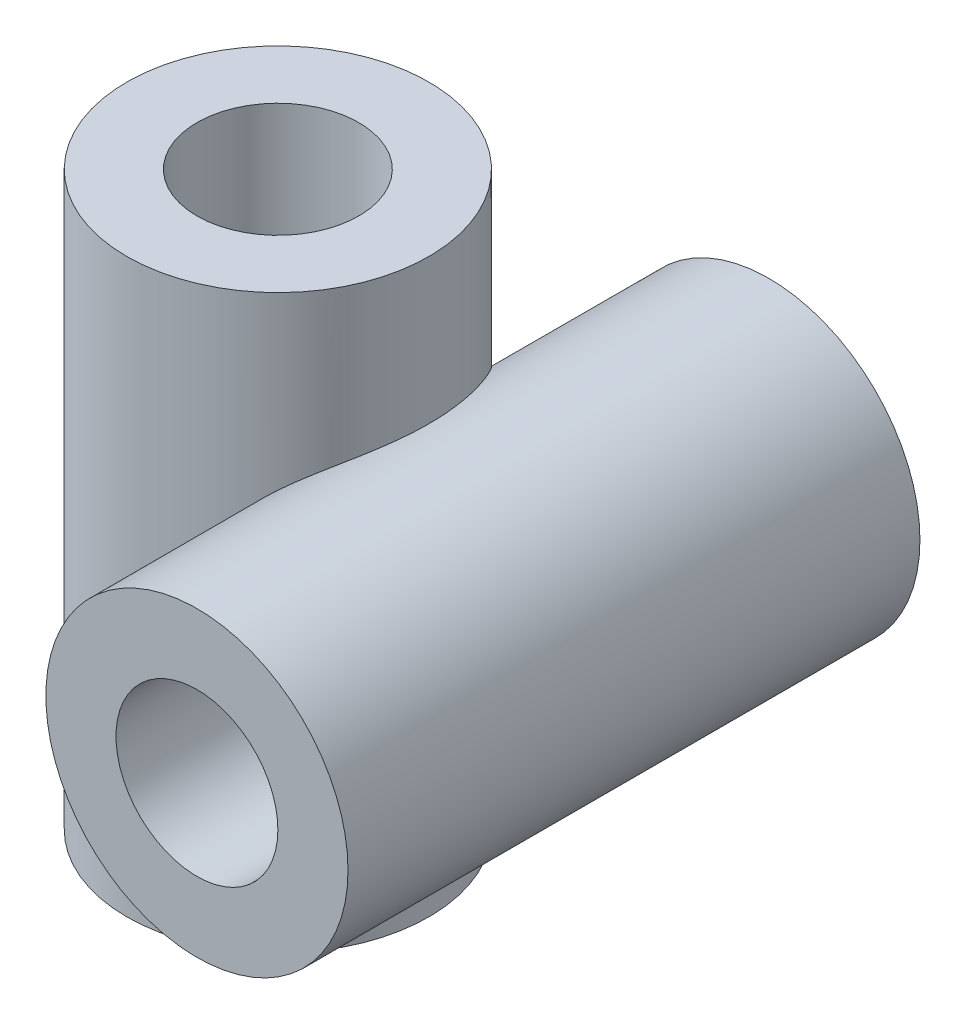
ISO-10303-21;
HEADER;
FILE_DESCRIPTION(('STEP AP214'),'2;1');
FILE_NAME('part.step','',(''),(''),'','','');
FILE_SCHEMA(('AUTOMOTIVE_DESIGN { 1 0 10303 214 1 1 1 1 }'));
ENDSEC;
DATA;
#1=APPLICATION_CONTEXT('core data for automotive mechanical design processes');
#2=APPLICATION_PROTOCOL_DEFINITION('international standard','automotive_design',2000,#1);
#3=PRODUCT_CONTEXT('',#1,'mechanical');
#4=PRODUCT('Part','Part','',(#3));
#5=PRODUCT_RELATED_PRODUCT_CATEGORY('part','',(#4));
#6=PRODUCT_DEFINITION_FORMATION('','',#4);
#7=PRODUCT_DEFINITION_CONTEXT('part definition',#1,'design');
#8=PRODUCT_DEFINITION('design','',#6,#7);
#9=PRODUCT_DEFINITION_SHAPE('','',#8);
#10=(LENGTH_UNIT() NAMED_UNIT(*) SI_UNIT(.MILLI.,.METRE.));
#11=(NAMED_UNIT(*) PLANE_ANGLE_UNIT() SI_UNIT($,.RADIAN.));
#12=(NAMED_UNIT(*) SI_UNIT($,.STERADIAN.) SOLID_ANGLE_UNIT());
#13=UNCERTAINTY_MEASURE_WITH_UNIT(LENGTH_MEASURE(1.E-05),#10,'distance_accuracy_value','');
#14=(GEOMETRIC_REPRESENTATION_CONTEXT(3) GLOBAL_UNCERTAINTY_ASSIGNED_CONTEXT((#13)) GLOBAL_UNIT_ASSIGNED_CONTEXT((#10,
#11,#12)) REPRESENTATION_CONTEXT('',''));
#15=CARTESIAN_POINT('',(0.,0.,0.));
#16=DIRECTION('',(0.,0.,1.));
#17=DIRECTION('',(1.,0.,0.));
#18=AXIS2_PLACEMENT_3D('',#15,#16,#17);
#19=CARTESIAN_POINT('',(-13.280466349688,1.62107894057616E-05,15.8999834577754));
#20=DIRECTION('',(0.,0.,-1.));
#21=DIRECTION('',(-1.,0.,0.));
#22=AXIS2_PLACEMENT_3D('',#19,#20,#21);
#23=CYLINDRICAL_SURFACE('',#22,8.4);
#24=CARTESIAN_POINT('',(-13.280466349688,1.62107894057616E-05,-15.9000165422246));
#25=DIRECTION('',(0.,0.,1.));
#26=DIRECTION('',(1.,0.,0.));
#27=AXIS2_PLACEMENT_3D('',#24,#25,#26);
#28=CIRCLE('',#27,8.4);
#29=CARTESIAN_POINT('',(-4.88046634968801,1.62107894057616E-05,-15.9000165422246));
#30=VERTEX_POINT('',#29);
#31=EDGE_CURVE('E53',#30,#30,#28,.T.);
#32=ORIENTED_EDGE('',*,*,#31,.T.);
#33=EDGE_LOOP('',(#32));
#34=FACE_BOUND('',#33,.T.);
#35=CARTESIAN_POINT('',(-13.280466349688,1.62107894057616E-05,15.8999834577754));
#36=DIRECTION('',(0.,0.,1.));
#37=DIRECTION('',(1.,0.,0.));
#38=AXIS2_PLACEMENT_3D('',#35,#36,#37);
#39=CIRCLE('',#38,8.4);
#40=CARTESIAN_POINT('',(-4.88046634968801,1.62107894057616E-05,15.8999834577754));
#41=VERTEX_POINT('',#40);
#42=EDGE_CURVE('E48',#41,#41,#39,.T.);
#43=ORIENTED_EDGE('',*,*,#42,.F.);
#44=EDGE_LOOP('',(#43));
#45=FACE_BOUND('',#44,.T.);
#46=CARTESIAN_POINT('',(-21.680466349688,1.62107894057616E-05,7.84600155614857));
#47=CARTESIAN_POINT('',(-21.6804658811288,0.213009276547163,7.84600200474655));
#48=CARTESIAN_POINT('',(-21.6723586139103,0.426010761498044,7.8429160419419));
#49=CARTESIAN_POINT('',(-21.6400016775848,0.850608369427983,7.8304286788699));
#50=CARTESIAN_POINT('',(-21.615751037933,1.06220440713855,7.82102689889317));
#51=CARTESIAN_POINT('',(-21.5513254211283,1.48262455674438,7.7954743598727));
#52=CARTESIAN_POINT('',(-21.5111450942864,1.69144771304542,7.77932133344951));
#53=CARTESIAN_POINT('',(-21.4152662078327,2.10478150312994,7.73956739994953));
#54=CARTESIAN_POINT('',(-21.3595679020481,2.30929220739319,7.71596661469466));
#55=CARTESIAN_POINT('',(-21.2330897505828,2.71306988763356,7.66029546315367));
#56=CARTESIAN_POINT('',(-21.1622677386617,2.91232041561602,7.62820135560316));
#57=CARTESIAN_POINT('',(-21.0065177559235,3.30341237864942,7.55442074887091));
#58=CARTESIAN_POINT('',(-20.9215896212678,3.49525372761293,7.51273413827277));
#59=CARTESIAN_POINT('',(-20.7388878993599,3.86981407832613,7.4185083440585));
#60=CARTESIAN_POINT('',(-20.6411219702732,4.05253842968806,7.3659756198958));
#61=CARTESIAN_POINT('',(-20.434295627754,4.40738336048205,7.24871809829957));
#62=CARTESIAN_POINT('',(-20.3252360763075,4.5795047475885,7.18399423104681));
#63=CARTESIAN_POINT('',(-20.1035692897998,4.9032598619759,7.04471641581932));
#64=CARTESIAN_POINT('',(-19.9914175371204,5.05548887589871,6.9708219196799));
#65=CARTESIAN_POINT('',(-19.7608337516443,5.34786579745063,6.81004632912228));
#66=CARTESIAN_POINT('',(-19.642401957473,5.48801416358277,6.72316572791486));
#67=CARTESIAN_POINT('',(-19.4017332416054,5.75522311061452,6.53589954917975));
#68=CARTESIAN_POINT('',(-19.2794989202121,5.88229238994342,6.43552305109479));
#69=CARTESIAN_POINT('',(-19.0337577905012,6.12285895398462,6.2210174632914));
#70=CARTESIAN_POINT('',(-18.9102510805979,6.2363572799215,6.1068894300033));
#71=CARTESIAN_POINT('',(-18.6764902309169,6.43931264907535,5.8767618642815));
#72=CARTESIAN_POINT('',(-18.566106347819,6.53003254911706,5.76200347071762));
#73=CARTESIAN_POINT('',(-18.3484040632656,6.70039777160637,5.52187111119714));
#74=CARTESIAN_POINT('',(-18.2410854445957,6.78004388033276,5.39649789994864));
#75=CARTESIAN_POINT('',(-18.0312667018319,6.92868404185236,5.13575552477083));
#76=CARTESIAN_POINT('',(-17.9287677100455,6.99767560011086,5.00038403089165));
#77=CARTESIAN_POINT('',(-17.7301941806824,7.12559528994008,4.72048798445765));
#78=CARTESIAN_POINT('',(-17.6341198921103,7.18452303160093,4.57596307756264));
#79=CARTESIAN_POINT('',(-17.4489287920682,7.29354586437919,4.27736650582661));
#80=CARTESIAN_POINT('',(-17.3598818934166,7.34355724271624,4.12322101633881));
#81=CARTESIAN_POINT('',(-17.1908584481251,7.43493835480905,3.80758458903021));
#82=CARTESIAN_POINT('',(-17.1108818662976,7.47630812208966,3.64609367970867));
#83=CARTESIAN_POINT('',(-16.9608962728592,7.55127236235985,3.31675718123482));
#84=CARTESIAN_POINT('',(-16.8908898755916,7.58486479744662,3.14890993990163));
#85=CARTESIAN_POINT('',(-16.761581014839,7.64507524335166,2.80792088194501));
#86=CARTESIAN_POINT('',(-16.7022794041219,7.67169269860314,2.63477864479365));
#87=CARTESIAN_POINT('',(-16.5896205953797,7.72100402839462,2.26687323104411));
#88=CARTESIAN_POINT('',(-16.5374307484802,7.74304981807142,2.07166486076563));
#89=CARTESIAN_POINT('',(-16.447164512859,7.78040230699529,1.67737822319741));
#90=CARTESIAN_POINT('',(-16.4090889148248,7.79570862870289,1.47829973975921));
#91=CARTESIAN_POINT('',(-16.3473908591984,7.8201874085224,1.07747293084606));
#92=CARTESIAN_POINT('',(-16.3237734700496,7.82935771570883,0.875723694408277));
#93=CARTESIAN_POINT('',(-16.2912161987666,7.84193484060936,0.470865669173007));
#94=CARTESIAN_POINT('',(-16.2822767398473,7.84534149213758,0.267756841343378));
#95=CARTESIAN_POINT('',(-16.2790401513572,7.84658026044155,-0.153238881806774));
#96=CARTESIAN_POINT('',(-16.2858441151253,7.84399315894045,-0.371136424302473));
#97=CARTESIAN_POINT('',(-16.3163469017055,7.83223771576085,-0.805577253220209));
#98=CARTESIAN_POINT('',(-16.3400466382347,7.82306901815192,-1.02212046576166));
#99=CARTESIAN_POINT('',(-16.4041175229143,7.79770758192926,-1.45238293552532));
#100=CARTESIAN_POINT('',(-16.4444936958347,7.78151272619256,-1.66610132155314));
#101=CARTESIAN_POINT('',(-16.5414928501224,7.74136360585683,-2.08908002532037));
#102=CARTESIAN_POINT('',(-16.5981155837189,7.71740945959128,-2.29834041099489));
#103=CARTESIAN_POINT('',(-16.7271901860286,7.66063509017973,-2.71154991180001));
#104=CARTESIAN_POINT('',(-16.7996989476755,7.62778289773995,-2.91547691015667));
#105=CARTESIAN_POINT('',(-16.9594800219258,7.55201403565815,-3.31554971909115));
#106=CARTESIAN_POINT('',(-17.046752585411,7.50909719498236,-3.51169539737076));
#107=CARTESIAN_POINT('',(-17.2346902986837,7.41185083199071,-3.89434787762617));
#108=CARTESIAN_POINT('',(-17.3353457352935,7.357529570506,-4.08086153540262));
#109=CARTESIAN_POINT('',(-17.5483714648909,7.23603765825386,-4.44268205784288));
#110=CARTESIAN_POINT('',(-17.6607405202395,7.16886836436063,-4.61799010331966));
#111=CARTESIAN_POINT('',(-17.8864689182116,7.0257733826181,-4.94349012069916));
#112=CARTESIAN_POINT('',(-17.9991611318218,6.95084061052164,-5.09458144984642));
#113=CARTESIAN_POINT('',(-18.2306176051984,6.78794780669525,-5.38461169723582));
#114=CARTESIAN_POINT('',(-18.3493815311485,6.69998849064748,-5.52355128243177));
#115=CARTESIAN_POINT('',(-18.5904880290716,6.51055753421973,-5.78829821225019));
#116=CARTESIAN_POINT('',(-18.7128280795194,6.409095243614,-5.91411453715581));
#117=CARTESIAN_POINT('',(-18.958552281378,6.19244315040437,-6.15216759716389));
#118=CARTESIAN_POINT('',(-19.081936357577,6.07725432896993,-6.26440530170885));
#119=CARTESIAN_POINT('',(-19.315208549744,5.84520898971708,-6.46494818442229));
#120=CARTESIAN_POINT('',(-19.4252472321542,5.72959256915708,-6.55451827406206));
#121=CARTESIAN_POINT('',(-19.6420965178034,5.48782290888116,-6.72263899231858));
#122=CARTESIAN_POINT('',(-19.748907354578,5.36167043394978,-6.80119041964397));
#123=CARTESIAN_POINT('',(-19.9575721441289,5.09946132513378,-6.94771656055683));
#124=CARTESIAN_POINT('',(-20.0594248641124,4.96340224883451,-7.01568865282239));
#125=CARTESIAN_POINT('',(-20.2565918767709,4.68223347224901,-7.14165686399585));
#126=CARTESIAN_POINT('',(-20.3519059042504,4.53712340532895,-7.19965257842666));
#127=CARTESIAN_POINT('',(-20.5357483504839,4.23702172465365,-7.30705325010011));
#128=CARTESIAN_POINT('',(-20.6241828399398,4.0819332947463,-7.35634811357319));
#129=CARTESIAN_POINT('',(-20.7918608473444,3.76447902694676,-7.44634481926657));
#130=CARTESIAN_POINT('',(-20.8711043846535,3.60211320438521,-7.48704667958798));
#131=CARTESIAN_POINT('',(-21.0195179215719,3.27110018097634,-7.56072585742027));
#132=CARTESIAN_POINT('',(-21.0886852842948,3.10245135034392,-7.59370115429545));
#133=CARTESIAN_POINT('',(-21.2162237969277,2.75993620284218,-7.6527259531708));
#134=CARTESIAN_POINT('',(-21.2745940927853,2.58606947449821,-7.67877490736569));
#135=CARTESIAN_POINT('',(-21.385244244621,2.21662572786487,-7.72695091429779));
#136=CARTESIAN_POINT('',(-21.4363412621762,2.02060910255775,-7.7484303819763));
#137=CARTESIAN_POINT('',(-21.5243236084844,1.62480186056447,-7.78468261990341));
#138=CARTESIAN_POINT('',(-21.5612081330455,1.4250110309916,-7.79945501065088));
#139=CARTESIAN_POINT('',(-21.6204370648025,1.0228604479532,-7.82288283297935));
#140=CARTESIAN_POINT('',(-21.642776348007,0.820499814764619,-7.83153610901352));
#141=CARTESIAN_POINT('',(-21.67270167597,0.414526925090436,-7.84307760037111));
#142=CARTESIAN_POINT('',(-21.6802873074174,0.210914633700977,-7.84596565418679));
#143=CARTESIAN_POINT('',(-21.6806515172329,-0.21071724464427,-7.84610600634365));
#144=CARTESIAN_POINT('',(-21.6723466031367,-0.428738834127586,-7.84294590915954));
#145=CARTESIAN_POINT('',(-21.6388271544614,-0.863290852639576,-7.8300070291739));
#146=CARTESIAN_POINT('',(-21.6136117142002,-1.07982120117388,-7.82022789187419));
#147=CARTESIAN_POINT('',(-21.5465110044715,-1.50991291209532,-7.7935797388926));
#148=CARTESIAN_POINT('',(-21.504620858981,-1.72347338710931,-7.77670864929869));
#149=CARTESIAN_POINT('',(-21.404615665438,-2.14598537805281,-7.73511403101576));
#150=CARTESIAN_POINT('',(-21.3465008869123,-2.35493697048375,-7.71039063276986));
#151=CARTESIAN_POINT('',(-21.2145883595033,-2.76704101819318,-7.65200324118369));
#152=CARTESIAN_POINT('',(-21.1407586432293,-2.97018068060209,-7.61832098830957));
#153=CARTESIAN_POINT('',(-20.978459321052,-3.36853753305498,-7.54078751968403));
#154=CARTESIAN_POINT('',(-20.8899894857544,-3.56375459890103,-7.49693614458951));
#155=CARTESIAN_POINT('',(-20.6998164794154,-3.94440639699779,-7.39771305770136));
#156=CARTESIAN_POINT('',(-20.5981232696165,-4.12984834658754,-7.34234999910404));
#157=CARTESIAN_POINT('',(-20.3832147622355,-4.48939472637393,-7.21867183007028));
#158=CARTESIAN_POINT('',(-20.2700007046758,-4.66350037342903,-7.15035811286952));
#159=CARTESIAN_POINT('',(-20.0430612528003,-4.98629473551474,-7.00510308967555));
#160=CARTESIAN_POINT('',(-19.9300011154162,-5.13591071764887,-6.92918239422623));
#161=CARTESIAN_POINT('',(-19.6980496712673,-5.42295949758989,-6.76431663865606));
#162=CARTESIAN_POINT('',(-19.5791586922535,-5.56039297895742,-6.6753723100354));
#163=CARTESIAN_POINT('',(-19.3380398782325,-5.82213554710429,-6.48400792643727));
#164=CARTESIAN_POINT('',(-19.2158142990907,-5.94645324260641,-6.38159681099771));
#165=CARTESIAN_POINT('',(-18.970554886654,-6.18154906981129,-6.1631216139427));
#166=CARTESIAN_POINT('',(-18.8475211091221,-6.29232812550648,-6.0470584651208));
#167=CARTESIAN_POINT('',(-18.6149798820601,-6.49028550546854,-5.81331167524739));
#168=CARTESIAN_POINT('',(-18.5053041201598,-6.57870769563801,-5.69684454049155));
#169=CARTESIAN_POINT('',(-18.2893410507945,-6.7445901365539,-5.45345391095246));
#170=CARTESIAN_POINT('',(-18.183053500274,-6.82205117498273,-5.3265311685607));
#171=CARTESIAN_POINT('',(-17.9755721250518,-6.96647290890303,-5.06287571439882));
#172=CARTESIAN_POINT('',(-17.8743795914935,-7.03343095180235,-4.92614053710934));
#173=CARTESIAN_POINT('',(-17.67864424574,-7.15745967525201,-4.64372289354349));
#174=CARTESIAN_POINT('',(-17.5841017119151,-7.2145299420441,-4.49804005319367));
#175=CARTESIAN_POINT('',(-17.4016254123267,-7.32032124370041,-4.1964436448937));
#176=CARTESIAN_POINT('',(-17.3138107748715,-7.36890555856937,-4.04041018966203));
#177=CARTESIAN_POINT('',(-17.1474928639684,-7.45752953644123,-3.72113394988694));
#178=CARTESIAN_POINT('',(-17.0689895889755,-7.49756920086198,-3.5578911665398));
#179=CARTESIAN_POINT('',(-16.922162316876,-7.56997424582048,-3.2251971559475));
#180=CARTESIAN_POINT('',(-16.8538410031981,-7.60233760461314,-3.0557443066646));
#181=CARTESIAN_POINT('',(-16.728087042134,-7.66018625894514,-2.71169825942166));
#182=CARTESIAN_POINT('',(-16.6706552497703,-7.68567101445735,-2.53710465906297));
#183=CARTESIAN_POINT('',(-16.5620340182296,-7.73271729184819,-2.16612958148809));
#184=CARTESIAN_POINT('',(-16.5120421488609,-7.75363214318089,-1.96931452461173));
#185=CARTESIAN_POINT('',(-16.4263671795508,-7.78878671702472,-1.57200732681851));
#186=CARTESIAN_POINT('',(-16.3906848969573,-7.80302605824593,-1.37151497654253));
#187=CARTESIAN_POINT('',(-16.3339462984246,-7.82540340432314,-0.968063421770544));
#188=CARTESIAN_POINT('',(-16.3128951526881,-7.8335392524692,-0.765103371015342));
#189=CARTESIAN_POINT('',(-16.2856206027477,-7.84404264832538,-0.358040659766142));
#190=CARTESIAN_POINT('',(-16.2793976016968,-7.84641003920061,-0.153937968356833));
#191=CARTESIAN_POINT('',(-16.281918650905,-7.84544711154983,0.268297506913861));
#192=CARTESIAN_POINT('',(-16.2917280920414,-7.84171122397518,0.486423914528298));
#193=CARTESIAN_POINT('',(-16.3282688623378,-7.82758117568967,0.921048021346524));
#194=CARTESIAN_POINT('',(-16.3550010887795,-7.81718666192408,1.1375456335722));
#195=CARTESIAN_POINT('',(-16.425130985459,-7.78923980811324,1.56742601966756));
#196=CARTESIAN_POINT('',(-16.4685333687674,-7.77168544371204,1.78080789491455));
#197=CARTESIAN_POINT('',(-16.5715379743808,-7.72862930614941,2.20281118805659));
#198=CARTESIAN_POINT('',(-16.6311399049992,-7.70312767608408,2.41143269159289));
#199=CARTESIAN_POINT('',(-16.7658718568751,-7.64311055842209,2.82238828246192));
#200=CARTESIAN_POINT('',(-16.8410090206782,-7.60859092273781,3.02471942831511));
#201=CARTESIAN_POINT('',(-17.0057958028369,-7.52927833960191,3.42131886841989));
#202=CARTESIAN_POINT('',(-17.0954456289297,-7.48448524509003,3.61558704720647));
#203=CARTESIAN_POINT('',(-17.2878155382913,-7.3832722618788,3.99419954493046));
#204=CARTESIAN_POINT('',(-17.3905254497377,-7.32686140069015,4.17855142981899));
#205=CARTESIAN_POINT('',(-17.6072707619964,-7.20098744412882,4.53578925790493));
#206=CARTESIAN_POINT('',(-17.7213049224622,-7.1315257774709,4.70867645337945));
#207=CARTESIAN_POINT('',(-17.9494049577844,-6.98410957489908,5.02874589641331));
#208=CARTESIAN_POINT('',(-18.0628086322961,-6.90720294574136,5.17688308555462));
#209=CARTESIAN_POINT('',(-18.2952063393012,-6.74037171079374,5.46094689388758));
#210=CARTESIAN_POINT('',(-18.4142000510401,-6.6504478513132,5.59687421237719));
#211=CARTESIAN_POINT('',(-18.6552832390539,-6.45716499631477,5.85561519484417));
#212=CARTESIAN_POINT('',(-18.7773706943297,-6.3538145984424,5.97843715990611));
#213=CARTESIAN_POINT('',(-19.0221205675152,-6.13353867312393,6.21058517000065));
#214=CARTESIAN_POINT('',(-19.1447829474049,-6.01661403152601,6.31991209475302));
#215=CARTESIAN_POINT('',(-19.3765644964301,-5.78118153215566,6.51530368500398));
#216=CARTESIAN_POINT('',(-19.4858688137871,-5.66386568349289,6.6025901221424));
#217=CARTESIAN_POINT('',(-19.7009307338062,-5.41885815555099,6.7662591181103));
#218=CARTESIAN_POINT('',(-19.8066885870918,-5.2911672116567,6.84264244869383));
#219=CARTESIAN_POINT('',(-20.0129782238903,-5.02606598130712,6.98498678746623));
#220=CARTESIAN_POINT('',(-20.11350853163,-4.88865297581293,7.05094486313561));
#221=CARTESIAN_POINT('',(-20.3078094042335,-4.60498202339493,7.17306113713497));
#222=CARTESIAN_POINT('',(-20.4015796879882,-4.4587237091121,7.22921892806746));
#223=CARTESIAN_POINT('',(-20.5826859763573,-4.15561999350063,7.33342126546353));
#224=CARTESIAN_POINT('',(-20.669876935282,-3.99863204046305,7.38130277005817));
#225=CARTESIAN_POINT('',(-20.8348269058079,-3.67751323679774,7.46856879595401));
#226=CARTESIAN_POINT('',(-20.9125858418997,-3.51338232900051,7.507953249233));
#227=CARTESIAN_POINT('',(-21.0578104766499,-3.1790011787481,7.57909330436551));
#228=CARTESIAN_POINT('',(-21.1252744415499,-3.00874991152574,7.61084762175737));
#229=CARTESIAN_POINT('',(-21.2492214529504,-2.66318549777746,7.66752564970778));
#230=CARTESIAN_POINT('',(-21.3057038006599,-2.48787202994436,7.6924489256295));
#231=CARTESIAN_POINT('',(-21.409827770022,-2.12393119804123,7.73731554803974));
#232=CARTESIAN_POINT('',(-21.4568529947268,-1.93508689090252,7.756930512901));
#233=CARTESIAN_POINT('',(-21.5377494868893,-1.55407794312351,7.79005668175011));
#234=CARTESIAN_POINT('',(-21.5716204750155,-1.36191323206459,7.8035677561222));
#235=CARTESIAN_POINT('',(-21.6259315942266,-0.97533822861996,7.82498640232461));
#236=CARTESIAN_POINT('',(-21.6463683603977,-0.780927386036854,7.83289257031449));
#237=CARTESIAN_POINT('',(-21.6736362526209,-0.391008022059341,7.84340005808324));
#238=CARTESIAN_POINT('',(-21.680466779799,-0.195499452728651,7.84600114436083));
#239=CARTESIAN_POINT('',(-21.680466349688,1.62107894057616E-05,7.84600155614857));
#240=B_SPLINE_CURVE_WITH_KNOTS('',3,(#46,#47,#48,#49,#50,#51,#52,#53,#54,#55,#56,#57,#58,#59,
#60,#61,#62,#63,#64,#65,#66,#67,#68,#69,#70,#71,#72,#73,#74,#75,#76,#77,#78,#79,#80,#81,#82,#83,
#84,#85,#86,#87,#88,#89,#90,#91,#92,#93,#94,#95,#96,#97,#98,#99,#100,#101,#102,#103,#104,#105,
#106,#107,#108,#109,#110,#111,#112,#113,#114,#115,#116,#117,#118,#119,#120,#121,#122,#123,#124,
#125,#126,#127,#128,#129,#130,#131,#132,#133,#134,#135,#136,#137,#138,#139,#140,#141,#142,#143,
#144,#145,#146,#147,#148,#149,#150,#151,#152,#153,#154,#155,#156,#157,#158,#159,#160,#161,#162,
#163,#164,#165,#166,#167,#168,#169,#170,#171,#172,#173,#174,#175,#176,#177,#178,#179,#180,#181,
#182,#183,#184,#185,#186,#187,#188,#189,#190,#191,#192,#193,#194,#195,#196,#197,#198,#199,#200,
#201,#202,#203,#204,#205,#206,#207,#208,#209,#210,#211,#212,#213,#214,#215,#216,#217,#218,#219,
#220,#221,#222,#223,#224,#225,#226,#227,#228,#229,#230,#231,#232,#233,#234,#235,#236,#237,#238,
#239),.UNSPECIFIED.,.T.,.F.,(4,2,2,2,2,2,2,2,2,2,2,2,2,2,2,2,2,2,2,2,2,2,2,2,2,2,2,2,2,2,2,2,2,
2,2,2,2,2,2,2,2,2,2,2,2,2,2,2,2,2,2,2,2,2,2,2,2,2,2,2,2,2,2,2,2,2,2,2,2,2,2,2,2,2,2,2,2,2,2,2,2,
2,2,2,2,2,2,2,2,2,2,2,2,2,2,2,4),(0.,0.638816942322448,1.27767229400407,1.91674237535659,
2.55580200407327,3.19666720982486,3.83753985956661,4.47803192991689,5.11847515068555,
5.72665543302695,6.33481262261755,6.94256269925336,7.55026611660821,8.09938338399658,
8.64846164216202,9.19766826097512,9.7468961532815,10.3010363188142,10.8551743345393,
11.4094573877281,11.9637845769184,12.5729161308226,13.1820818034366,13.791460901961,
14.4008575706664,15.0541500597523,15.7074778813334,16.3610027006211,17.0145175537627,
17.6704122654023,18.3263181238072,18.9817505037446,19.63711370198,20.2447854204702,
20.8524237656733,21.459643536007,22.0668199284087,22.6152389417369,23.1636181813074,
23.7121330813817,24.260670214922,24.8157157361469,25.3707600881611,25.9259494326804,
26.4811826741407,27.0916289770386,27.7021098160252,28.312805598751,28.9235184893548,
29.5773594409442,30.2312354132863,30.8853027328928,31.5393591876542,32.1947590638269,
32.8501692103553,33.5050884624078,34.1599372979947,34.7660452791157,35.3721192299363,
35.9777928681201,36.5834251468504,37.1311375083985,37.6788104906249,38.2266215688914,
38.7744555650147,39.3304330015388,39.8864103458073,40.4425339582791,40.998701218353,
41.6104543475863,42.2222424145073,42.8342465591238,43.4462673429432,44.1006349853564,
44.7550373266265,45.4096248201688,46.064200528085,46.7190778584441,47.373964563683,
48.0283443005237,48.6826524419503,49.2871906519398,49.8916942160059,50.4958125785514,
51.099891538781,51.6469302311066,52.193930183198,52.741083728101,53.2882600127426,
53.8452210920204,54.402186629824,54.9592458619573,55.5163405297235,56.1025535454044,
56.6887790086996,57.2751512499217,57.8615492995502),.UNSPECIFIED.);
#241=CARTESIAN_POINT('',(-21.680466349688,1.62107894057616E-05,7.84600155614857));
#242=VERTEX_POINT('',#241);
#243=EDGE_CURVE('E10',#242,#242,#240,.T.);
#244=ORIENTED_EDGE('',*,*,#243,.F.);
#245=EDGE_LOOP('',(#244));
#246=FACE_BOUND('',#245,.T.);
#247=ADVANCED_FACE('F35',(#34,#45,#246),#23,.T.);
#248=CARTESIAN_POINT('',(-13.280466349688,1.62107894057616E-05,15.8999834577754));
#249=DIRECTION('',(0.,0.,-1.));
#250=DIRECTION('',(-1.,0.,0.));
#251=AXIS2_PLACEMENT_3D('',#248,#249,#250);
#252=CYLINDRICAL_SURFACE('',#251,4.5);
#253=CARTESIAN_POINT('',(-13.280466349688,1.62107894057616E-05,-15.9000165422246));
#254=DIRECTION('',(0.,0.,1.));
#255=DIRECTION('',(1.,0.,0.));
#256=AXIS2_PLACEMENT_3D('',#253,#254,#255);
#257=CIRCLE('',#256,4.5);
#258=CARTESIAN_POINT('',(-8.78046634968801,1.62107894057616E-05,-15.9000165422246));
#259=VERTEX_POINT('',#258);
#260=EDGE_CURVE('E101',#259,#259,#257,.T.);
#261=ORIENTED_EDGE('',*,*,#260,.F.);
#262=EDGE_LOOP('',(#261));
#263=FACE_BOUND('',#262,.T.);
#264=CARTESIAN_POINT('',(-13.280466349688,1.62107894057616E-05,15.8999834577754));
#265=DIRECTION('',(0.,0.,1.));
#266=DIRECTION('',(1.,0.,0.));
#267=AXIS2_PLACEMENT_3D('',#264,#265,#266);
#268=CIRCLE('',#267,4.5);
#269=CARTESIAN_POINT('',(-8.78046634968801,1.62107894057616E-05,15.8999834577754));
#270=VERTEX_POINT('',#269);
#271=EDGE_CURVE('E62',#270,#270,#268,.T.);
#272=ORIENTED_EDGE('',*,*,#271,.T.);
#273=EDGE_LOOP('',(#272));
#274=FACE_BOUND('',#273,.T.);
#275=CARTESIAN_POINT('',(-17.780466349688,1.62107894057616E-05,4.79059928457675));
#276=CARTESIAN_POINT('',(-17.7804614227513,0.16071812417443,4.79059593945373));
#277=CARTESIAN_POINT('',(-17.7717765681441,0.321458031386691,4.77815632368595));
#278=CARTESIAN_POINT('',(-17.7379404355605,0.637354605607126,4.72885133677424));
#279=CARTESIAN_POINT('',(-17.7127831759599,0.79250922282892,4.69197709262567));
#280=CARTESIAN_POINT('',(-17.6487009493185,1.09174578601769,4.59537050730937));
#281=CARTESIAN_POINT('',(-17.6098285727733,1.23586750386234,4.53572541008469));
#282=CARTESIAN_POINT('',(-17.5219502550358,1.51017960276783,4.39571283386305));
#283=CARTESIAN_POINT('',(-17.4729432056507,1.64036845795197,4.31534308845713));
#284=CARTESIAN_POINT('',(-17.3686592730541,1.88535660321402,4.13619468399624));
#285=CARTESIAN_POINT('',(-17.3133563946276,2.00008747729444,4.03733853117159));
#286=CARTESIAN_POINT('',(-17.2005627541145,2.21302060920439,3.82431959022079));
#287=CARTESIAN_POINT('',(-17.1430712447709,2.31121715857951,3.71015154002137));
#288=CARTESIAN_POINT('',(-17.0431026917237,2.46964850403882,3.49867922316272));
#289=CARTESIAN_POINT('',(-17.0003708560117,2.53331042314373,3.4040153002111));
#290=CARTESIAN_POINT('',(-16.9167091102214,2.65199898161415,3.20862223706344));
#291=CARTESIAN_POINT('',(-16.8757799098498,2.7070222413792,3.1078907443421));
#292=CARTESIAN_POINT('',(-16.7966122547133,2.80909069977816,2.90121054727115));
#293=CARTESIAN_POINT('',(-16.7583790842863,2.85612047195211,2.79525225282484));
#294=CARTESIAN_POINT('',(-16.6854127824039,2.94272645627834,2.57915674699042));
#295=CARTESIAN_POINT('',(-16.6506805129251,2.98230083487008,2.46901851558022));
#296=CARTESIAN_POINT('',(-16.5751668611437,3.06580127370727,2.2107252376274));
#297=CARTESIAN_POINT('',(-16.5358390311939,3.10728498271402,2.06135169627277));
#298=CARTESIAN_POINT('',(-16.4650690510553,3.17977512014121,1.75824799500603));
#299=CARTESIAN_POINT('',(-16.4336293036095,3.21077835716247,1.60451652348228));
#300=CARTESIAN_POINT('',(-16.3792217057942,3.26331905052579,1.29389693968097));
#301=CARTESIAN_POINT('',(-16.3562582081683,3.28485164456538,1.13700724907309));
#302=CARTESIAN_POINT('',(-16.3192000885536,3.31916266080194,0.821260960396908));
#303=CARTESIAN_POINT('',(-16.3051047156476,3.33194182421236,0.662404530026057));
#304=CARTESIAN_POINT('',(-16.2858422974927,3.34932756530126,0.341348042955086));
#305=CARTESIAN_POINT('',(-16.2808101389527,3.35381070064272,0.179133247282298));
#306=CARTESIAN_POINT('',(-16.280156613698,3.35439519517351,-0.145340468978212));
#307=CARTESIAN_POINT('',(-16.2845358541695,3.35049601356889,-0.307599391737555));
#308=CARTESIAN_POINT('',(-16.3026422748786,3.33417297414574,-0.631133653063738));
#309=CARTESIAN_POINT('',(-16.3163675246065,3.32175087681478,-0.792409187819014));
#310=CARTESIAN_POINT('',(-16.3529601023076,3.28793444098785,-1.11296378960327));
#311=CARTESIAN_POINT('',(-16.3758261781917,3.26654133130044,-1.27224312698613));
#312=CARTESIAN_POINT('',(-16.4268901804874,3.21732955066714,-1.56783835442283));
#313=CARTESIAN_POINT('',(-16.4540564403313,3.19065676243885,-1.70452381504155));
#314=CARTESIAN_POINT('',(-16.5146860154467,3.12918373586716,-1.97465305806595));
#315=CARTESIAN_POINT('',(-16.5481494978472,3.09438328180883,-2.10809675432873));
#316=CARTESIAN_POINT('',(-16.6207610710282,3.0158560491001,-2.37059900770376));
#317=CARTESIAN_POINT('',(-16.6599027551707,2.97213930830376,-2.49966230729013));
#318=CARTESIAN_POINT('',(-16.7430566701436,2.87482994286508,-2.75233126538415));
#319=CARTESIAN_POINT('',(-16.7870673274266,2.82124050516299,-2.87593866915812));
#320=CARTESIAN_POINT('',(-16.9008353796661,2.67493707716196,-3.17387190656558));
#321=CARTESIAN_POINT('',(-16.9728580581344,2.57575545950951,-3.3442570197867));
#322=CARTESIAN_POINT('',(-17.120027977483,2.35070358128997,-3.6648238741721));
#323=CARTESIAN_POINT('',(-17.1951704189847,2.22487317673969,-3.81503524501122));
#324=CARTESIAN_POINT('',(-17.3277246605943,1.9713509232063,-4.06366751190911));
#325=CARTESIAN_POINT('',(-17.385829372902,1.84838398434484,-4.16652254765095));
#326=CARTESIAN_POINT('',(-17.4946548857772,1.58458623657165,-4.35152749933503));
#327=CARTESIAN_POINT('',(-17.5453778573096,1.44376070275462,-4.4336835080659));
#328=CARTESIAN_POINT('',(-17.6123968407819,1.2208769200754,-4.53919669638644));
#329=CARTESIAN_POINT('',(-17.6332903670725,1.14431336980988,-4.57150698108037));
#330=CARTESIAN_POINT('',(-17.671420158393,0.987936053429828,-4.62975527143374));
#331=CARTESIAN_POINT('',(-17.6886581897235,0.90812387934287,-4.65569635559124));
#332=CARTESIAN_POINT('',(-17.7189909615537,0.745875899981189,-4.70093216870184));
#333=CARTESIAN_POINT('',(-17.7320862232346,0.663440426167968,-4.72022773372163));
#334=CARTESIAN_POINT('',(-17.753762483842,0.496710201208924,-4.75197744648533));
#335=CARTESIAN_POINT('',(-17.7623440442059,0.412415682660261,-4.76443244510239));
#336=CARTESIAN_POINT('',(-17.7794393426401,0.177910365851342,-4.78919931664446));
#337=CARTESIAN_POINT('',(-17.7829111033191,0.0264520022472098,-4.79415934735804));
#338=CARTESIAN_POINT('',(-17.7745868571024,-0.275042744658658,-4.78215638857986));
#339=CARTESIAN_POINT('',(-17.7627960406342,-0.425079593906772,-4.76520085203683));
#340=CARTESIAN_POINT('',(-17.7258482769547,-0.713308314051225,-4.71109832262479));
#341=CARTESIAN_POINT('',(-17.7012544709481,-0.851733750976242,-4.67480061891181));
#342=CARTESIAN_POINT('',(-17.6410824090323,-1.11976638329427,-4.58368650765826));
#343=CARTESIAN_POINT('',(-17.6055036141886,-1.24937314565343,-4.52886919151446));
#344=CARTESIAN_POINT('',(-17.5240185676974,-1.50365113943947,-4.39903974752556));
#345=CARTESIAN_POINT('',(-17.4776727203768,-1.62771866817493,-4.32312839819725));
#346=CARTESIAN_POINT('',(-17.3793048679172,-1.86160977388416,-4.1548340396986));
#347=CARTESIAN_POINT('',(-17.3272800949901,-1.97142634765977,-4.06244298463461));
#348=CARTESIAN_POINT('',(-17.2367376613291,-2.1457963787503,-3.89324241515047));
#349=CARTESIAN_POINT('',(-17.1987892529662,-2.21411555972004,-3.81993640134275));
#350=CARTESIAN_POINT('',(-17.1227710662654,-2.34355527220959,-3.66723755313118));
#351=CARTESIAN_POINT('',(-17.0847012533177,-2.40467351869108,-3.58784279974025));
#352=CARTESIAN_POINT('',(-17.0093022327479,-2.52001177204297,-3.42367175595902));
#353=CARTESIAN_POINT('',(-16.9719742973471,-2.57422066925003,-3.33888711908088));
#354=CARTESIAN_POINT('',(-16.8988713214135,-2.67600148506814,-3.16477589323458));
#355=CARTESIAN_POINT('',(-16.8630966804311,-2.72357170291238,-3.07544814833341));
#356=CARTESIAN_POINT('',(-16.7822040737553,-2.82725939286055,-2.86259423213873));
#357=CARTESIAN_POINT('',(-16.7379315767255,-2.88096441437644,-2.73756761617652));
#358=CARTESIAN_POINT('',(-16.6544074825109,-2.97834503385799,-2.4820456400064));
#359=CARTESIAN_POINT('',(-16.615157568374,-3.02201727375608,-2.35154846598211));
#360=CARTESIAN_POINT('',(-16.5424881464045,-3.10031728098017,-2.08621950264316));
#361=CARTESIAN_POINT('',(-16.5090719379425,-3.13493993559767,-1.95138531115954));
#362=CARTESIAN_POINT('',(-16.4486808220768,-3.19595909978995,-1.67848081029114));
#363=CARTESIAN_POINT('',(-16.4217054285182,-3.22235623027602,-1.54041074601561));
#364=CARTESIAN_POINT('',(-16.3740407249532,-3.26815075402016,-1.25865887655373));
#365=CARTESIAN_POINT('',(-16.3535122627295,-3.28737100921144,-1.1149212461937));
#366=CARTESIAN_POINT('',(-16.319888191839,-3.31848318206004,-0.825799236739642));
#367=CARTESIAN_POINT('',(-16.306792681563,-3.33037500271012,-0.680414835873099));
#368=CARTESIAN_POINT('',(-16.2881895384362,-3.34718543415262,-0.388685378473855));
#369=CARTESIAN_POINT('',(-16.2826858777229,-3.35210039461559,-0.24233985927491));
#370=CARTESIAN_POINT('',(-16.2793416674302,-3.35509169560843,0.0505109979825237));
#371=CARTESIAN_POINT('',(-16.2815015574307,-3.35316764385374,0.197016344726828));
#372=CARTESIAN_POINT('',(-16.2945613258854,-3.34144068944216,0.516295600577967));
#373=CARTESIAN_POINT('',(-16.3069911064633,-3.33025784939114,0.688960627736457));
#374=CARTESIAN_POINT('',(-16.3423543203167,-3.29777358389158,1.03229964795276));
#375=CARTESIAN_POINT('',(-16.3652902594103,-3.276469744444,1.20297315605006));
#376=CARTESIAN_POINT('',(-16.4212194175214,-3.22289713657947,1.54080524919));
#377=CARTESIAN_POINT('',(-16.4542053926996,-3.19063626382942,1.70796627348935));
#378=CARTESIAN_POINT('',(-16.5295213159356,-3.11391037330934,2.03728086835028));
#379=CARTESIAN_POINT('',(-16.5718467862392,-3.06945120144863,2.19943679624507));
#380=CARTESIAN_POINT('',(-16.6500975027575,-2.98290543646594,2.4669774123719));
#381=CARTESIAN_POINT('',(-16.683853605607,-2.94446455495516,2.57418762904052));
#382=CARTESIAN_POINT('',(-16.7546946043861,-2.86053574401459,2.78466650102993));
#383=CARTESIAN_POINT('',(-16.7917786367088,-2.8150496406282,2.88793616907716));
#384=CARTESIAN_POINT('',(-16.8685640928813,-2.71649793237011,3.08961174886894));
#385=CARTESIAN_POINT('',(-16.9082618743797,-2.66344275973163,3.18802410809624));
#386=CARTESIAN_POINT('',(-16.9894429624261,-2.54918005436432,3.37917845587455));
#387=CARTESIAN_POINT('',(-17.0309258558863,-2.48797440092146,3.47192174439303));
#388=CARTESIAN_POINT('',(-17.1384266346706,-2.31968522405248,3.70153433544666));
#389=CARTESIAN_POINT('',(-17.205021911543,-2.20626344119738,3.8336135016899));
#390=CARTESIAN_POINT('',(-17.3349019304178,-1.95732041577317,4.07695998772064));
#391=CARTESIAN_POINT('',(-17.3981898408837,-1.82182085606499,4.18824749934541));
#392=CARTESIAN_POINT('',(-17.5064941051449,-1.55192486390649,4.37075861713185));
#393=CARTESIAN_POINT('',(-17.5528266516888,-1.42044099925178,4.44549271374115));
#394=CARTESIAN_POINT('',(-17.6348215653375,-1.14463465687848,4.57434154783522));
#395=CARTESIAN_POINT('',(-17.6704907883379,-1.00032050606816,4.62846953999292));
#396=CARTESIAN_POINT('',(-17.7255104777256,-0.714790953611441,4.71069994457363));
#397=CARTESIAN_POINT('',(-17.7459638358983,-0.574300889467947,4.74058002321853));
#398=CARTESIAN_POINT('',(-17.7734446763492,-0.289212350760235,4.7805322126334));
#399=CARTESIAN_POINT('',(-17.780470783868,-0.14461345704835,4.79060229514471));
#400=CARTESIAN_POINT('',(-17.780466349688,1.62107894057616E-05,4.79059928457675));
#401=B_SPLINE_CURVE_WITH_KNOTS('',3,(#275,#276,#277,#278,#279,#280,#281,#282,#283,#284,#285,
#286,#287,#288,#289,#290,#291,#292,#293,#294,#295,#296,#297,#298,#299,#300,#301,#302,#303,#304,
#305,#306,#307,#308,#309,#310,#311,#312,#313,#314,#315,#316,#317,#318,#319,#320,#321,#322,#323,
#324,#325,#326,#327,#328,#329,#330,#331,#332,#333,#334,#335,#336,#337,#338,#339,#340,#341,#342,
#343,#344,#345,#346,#347,#348,#349,#350,#351,#352,#353,#354,#355,#356,#357,#358,#359,#360,#361,
#362,#363,#364,#365,#366,#367,#368,#369,#370,#371,#372,#373,#374,#375,#376,#377,#378,#379,#380,
#381,#382,#383,#384,#385,#386,#387,#388,#389,#390,#391,#392,#393,#394,#395,#396,#397,#398,#399,
#400),.UNSPECIFIED.,.T.,.F.,(4,2,2,2,2,2,2,2,2,2,2,2,2,2,2,2,2,2,2,2,2,2,2,2,2,2,2,2,2,2,2,2,2,
2,2,2,2,2,2,2,2,2,2,2,2,2,2,2,2,2,2,2,2,2,2,2,2,2,2,2,2,2,4),(0.,0.481475560328566,
0.963126055903356,1.44294938725931,1.92282521347178,2.4047596707688,2.88686017566515,
3.251851037251,3.61698433597961,3.98281448782286,4.34873449388298,4.82787689453173,
5.30716506725349,5.78669902386584,6.26619237000356,6.75276477275408,7.23936856817308,
7.72587188129674,8.2123085771602,8.63759325508404,9.06288922169535,9.48770901189664,
9.91239190834178,10.5397063069495,11.1660890352382,11.6756374429512,12.1850356886592,
12.4417853874026,12.6984107430131,12.9550038010183,13.2115649351149,13.6637712924196,
14.1158239058502,14.5494903378137,14.98317804927,15.439337305294,15.8957198848038,
16.2167719710643,16.5379256624226,16.8595893972042,17.1813353885017,17.6099953859195,
18.0387986515562,18.4678436553838,18.8968562645016,19.3358499282715,19.7748494029199,
20.2140784798204,20.6533327512313,21.1731262134488,21.6930437159238,22.212587356591,
22.7318824449091,23.0879724989259,23.4439704123199,23.7994823209624,24.1549123994079,
24.711834290844,25.268212483163,25.7407228146405,26.2129286928923,26.6462061835426,
27.0795280332674),.UNSPECIFIED.);
#402=CARTESIAN_POINT('',(-17.780466349688,1.62107894057616E-05,4.79059928457675));
#403=VERTEX_POINT('',#402);
#404=EDGE_CURVE('E39',#403,#403,#401,.T.);
#405=ORIENTED_EDGE('',*,*,#404,.T.);
#406=EDGE_LOOP('',(#405));
#407=FACE_BOUND('',#406,.T.);
#408=ADVANCED_FACE('F74',(#263,#274,#407),#252,.F.);
#409=CARTESIAN_POINT('',(-13.280466349688,1.62107894057616E-05,15.8999834577754));
#410=DIRECTION('',(0.,0.,1.));
#411=DIRECTION('',(1.,0.,0.));
#412=AXIS2_PLACEMENT_3D('',#409,#410,#411);
#413=PLANE('',#412);
#414=ORIENTED_EDGE('',*,*,#42,.T.);
#415=EDGE_LOOP('',(#414));
#416=FACE_BOUND('',#415,.T.);
#417=ORIENTED_EDGE('',*,*,#271,.F.);
#418=EDGE_LOOP('',(#417));
#419=FACE_BOUND('',#418,.T.);
#420=ADVANCED_FACE('F79',(#416,#419),#413,.T.);
#421=CARTESIAN_POINT('',(-13.280466349688,1.62107894057616E-05,-15.9000165422246));
#422=DIRECTION('',(0.,0.,1.));
#423=DIRECTION('',(1.,0.,0.));
#424=AXIS2_PLACEMENT_3D('',#421,#422,#423);
#425=PLANE('',#424);
#426=ORIENTED_EDGE('',*,*,#31,.F.);
#427=EDGE_LOOP('',(#426));
#428=FACE_BOUND('',#427,.T.);
#429=ORIENTED_EDGE('',*,*,#260,.T.);
#430=EDGE_LOOP('',(#429));
#431=FACE_BOUND('',#430,.T.);
#432=ADVANCED_FACE('F69',(#428,#431),#425,.F.);
#433=CARTESIAN_POINT('',(-24.680466349688,15.9000162107894,-1.65422246443522E-05));
#434=DIRECTION('',(0.,-1.,0.));
#435=DIRECTION('',(0.,0.,-1.));
#436=AXIS2_PLACEMENT_3D('',#433,#434,#435);
#437=CYLINDRICAL_SURFACE('',#436,8.4);
#438=ORIENTED_EDGE('',*,*,#404,.F.);
#439=EDGE_LOOP('',(#438));
#440=FACE_BOUND('',#439,.T.);
#441=ADVANCED_FACE('F64',(#440),#437,.T.);
#442=CARTESIAN_POINT('',(-24.680466349688,15.9000162107894,-1.65422246443522E-05));
#443=DIRECTION('',(0.,-1.,0.));
#444=DIRECTION('',(0.,0.,-1.));
#445=AXIS2_PLACEMENT_3D('',#442,#443,#444);
#446=CYLINDRICAL_SURFACE('',#445,4.5);
#447=CARTESIAN_POINT('',(-24.680466349688,15.9000162107894,-1.65422246443522E-05));
#448=DIRECTION('',(0.,1.,0.));
#449=DIRECTION('',(0.,0.,1.));
#450=AXIS2_PLACEMENT_3D('',#447,#448,#449);
#451=CIRCLE('',#450,4.5);
#452=CARTESIAN_POINT('',(-24.680466349688,15.9000162107894,4.49998345777535));
#453=VERTEX_POINT('',#452);
#454=EDGE_CURVE('E112',#453,#453,#451,.T.);
#455=ORIENTED_EDGE('',*,*,#454,.T.);
#456=EDGE_LOOP('',(#455));
#457=FACE_BOUND('',#456,.T.);
#458=CARTESIAN_POINT('',(-24.680466349688,-15.8999837892106,-1.65422246443522E-05));
#459=DIRECTION('',(0.,1.,0.));
#460=DIRECTION('',(0.,0.,1.));
#461=AXIS2_PLACEMENT_3D('',#458,#459,#460);
#462=CIRCLE('',#461,4.5);
#463=CARTESIAN_POINT('',(-24.680466349688,-15.8999837892106,4.49998345777535));
#464=VERTEX_POINT('',#463);
#465=EDGE_CURVE('E114',#464,#464,#462,.T.);
#466=ORIENTED_EDGE('',*,*,#465,.F.);
#467=EDGE_LOOP('',(#466));
#468=FACE_BOUND('',#467,.T.);
#469=ADVANCED_FACE('F68',(#457,#468),#446,.F.);
#470=CARTESIAN_POINT('',(-24.680466349688,15.9000162107894,-1.65422246443522E-05));
#471=DIRECTION('',(0.,1.,0.));
#472=DIRECTION('',(0.,0.,1.));
#473=AXIS2_PLACEMENT_3D('',#470,#471,#472);
#474=CIRCLE('',#473,8.4);
#475=CARTESIAN_POINT('',(-24.680466349688,15.9000162107894,8.39998345777536));
#476=VERTEX_POINT('',#475);
#477=EDGE_CURVE('E105',#476,#476,#474,.T.);
#478=ORIENTED_EDGE('',*,*,#477,.F.);
#479=EDGE_LOOP('',(#478));
#480=FACE_BOUND('',#479,.T.);
#481=CARTESIAN_POINT('',(-24.680466349688,-15.8999837892106,-1.65422246443522E-05));
#482=DIRECTION('',(0.,1.,0.));
#483=DIRECTION('',(0.,0.,1.));
#484=AXIS2_PLACEMENT_3D('',#481,#482,#483);
#485=CIRCLE('',#484,8.4);
#486=CARTESIAN_POINT('',(-24.680466349688,-15.8999837892106,8.39998345777536));
#487=VERTEX_POINT('',#486);
#488=EDGE_CURVE('E60',#487,#487,#485,.T.);
#489=ORIENTED_EDGE('',*,*,#488,.T.);
#490=EDGE_LOOP('',(#489));
#491=FACE_BOUND('',#490,.T.);
#492=ORIENTED_EDGE('',*,*,#243,.T.);
#493=EDGE_LOOP('',(#492));
#494=FACE_BOUND('',#493,.T.);
#495=ADVANCED_FACE('F71',(#480,#491,#494),#437,.T.);
#496=CARTESIAN_POINT('',(-24.680466349688,15.9000162107894,-1.65422246443522E-05));
#497=DIRECTION('',(0.,1.,0.));
#498=DIRECTION('',(0.,0.,1.));
#499=AXIS2_PLACEMENT_3D('',#496,#497,#498);
#500=PLANE('',#499);
#501=ORIENTED_EDGE('',*,*,#477,.T.);
#502=EDGE_LOOP('',(#501));
#503=FACE_BOUND('',#502,.T.);
#504=ORIENTED_EDGE('',*,*,#454,.F.);
#505=EDGE_LOOP('',(#504));
#506=FACE_BOUND('',#505,.T.);
#507=ADVANCED_FACE('F122',(#503,#506),#500,.T.);
#508=CARTESIAN_POINT('',(-24.680466349688,-15.8999837892106,-1.65422246443522E-05));
#509=DIRECTION('',(0.,1.,0.));
#510=DIRECTION('',(0.,0.,1.));
#511=AXIS2_PLACEMENT_3D('',#508,#509,#510);
#512=PLANE('',#511);
#513=ORIENTED_EDGE('',*,*,#488,.F.);
#514=EDGE_LOOP('',(#513));
#515=FACE_BOUND('',#514,.T.);
#516=ORIENTED_EDGE('',*,*,#465,.T.);
#517=EDGE_LOOP('',(#516));
#518=FACE_BOUND('',#517,.T.);
#519=ADVANCED_FACE('F72',(#515,#518),#512,.F.);
#520=CLOSED_SHELL('',(#247,#408,#420,#432,#441,#469,#495,#507,#519));
#521=MANIFOLD_SOLID_BREP('B2',#520);
#522=ADVANCED_BREP_SHAPE_REPRESENTATION('',(#18,#521),#14);
#523=SHAPE_DEFINITION_REPRESENTATION(#9,#522);
ENDSEC;
END-ISO-10303-21;
